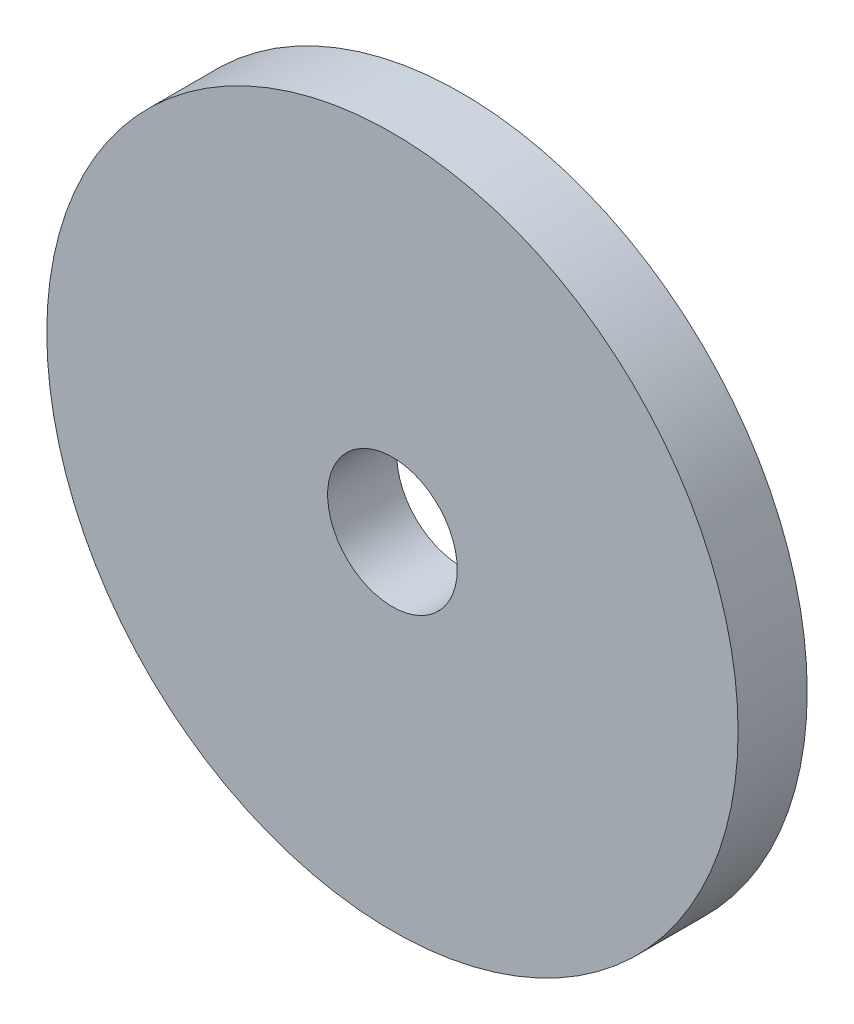
ISO-10303-21;
HEADER;
FILE_DESCRIPTION(('STEP AP214'),'2;1');
FILE_NAME('part.step','',(''),(''),'','','');
FILE_SCHEMA(('AUTOMOTIVE_DESIGN { 1 0 10303 214 1 1 1 1 }'));
ENDSEC;
DATA;
#1=APPLICATION_CONTEXT('core data for automotive mechanical design processes');
#2=APPLICATION_PROTOCOL_DEFINITION('international standard','automotive_design',2000,#1);
#3=PRODUCT_CONTEXT('',#1,'mechanical');
#4=PRODUCT('Part','Part','',(#3));
#5=PRODUCT_RELATED_PRODUCT_CATEGORY('part','',(#4));
#6=PRODUCT_DEFINITION_FORMATION('','',#4);
#7=PRODUCT_DEFINITION_CONTEXT('part definition',#1,'design');
#8=PRODUCT_DEFINITION('design','',#6,#7);
#9=PRODUCT_DEFINITION_SHAPE('','',#8);
#10=(LENGTH_UNIT() NAMED_UNIT(*) SI_UNIT(.MILLI.,.METRE.));
#11=(NAMED_UNIT(*) PLANE_ANGLE_UNIT() SI_UNIT($,.RADIAN.));
#12=(NAMED_UNIT(*) SI_UNIT($,.STERADIAN.) SOLID_ANGLE_UNIT());
#13=UNCERTAINTY_MEASURE_WITH_UNIT(LENGTH_MEASURE(1.E-05),#10,'distance_accuracy_value','');
#14=(GEOMETRIC_REPRESENTATION_CONTEXT(3) GLOBAL_UNCERTAINTY_ASSIGNED_CONTEXT((#13)) GLOBAL_UNIT_ASSIGNED_CONTEXT((#10,
#11,#12)) REPRESENTATION_CONTEXT('',''));
#15=CARTESIAN_POINT('',(0.,0.,0.));
#16=DIRECTION('',(0.,0.,1.));
#17=DIRECTION('',(1.,0.,0.));
#18=AXIS2_PLACEMENT_3D('',#15,#16,#17);
#19=CARTESIAN_POINT('',(0.,0.,2.54));
#20=DIRECTION('',(0.,0.,1.));
#21=DIRECTION('',(1.,0.,0.));
#22=AXIS2_PLACEMENT_3D('',#19,#20,#21);
#23=PLANE('',#22);
#24=CARTESIAN_POINT('',(0.,0.,2.54));
#25=DIRECTION('',(0.,0.,1.));
#26=DIRECTION('',(1.,0.,0.));
#27=AXIS2_PLACEMENT_3D('',#24,#25,#26);
#28=CIRCLE('',#27,12.7);
#29=CARTESIAN_POINT('',(12.7,0.,2.54));
#30=VERTEX_POINT('',#29);
#31=EDGE_CURVE('E10',#30,#30,#28,.T.);
#32=ORIENTED_EDGE('',*,*,#31,.T.);
#33=EDGE_LOOP('',(#32));
#34=FACE_BOUND('',#33,.T.);
#35=CARTESIAN_POINT('',(0.,0.,2.54));
#36=DIRECTION('',(0.,0.,1.));
#37=DIRECTION('',(1.,0.,0.));
#38=AXIS2_PLACEMENT_3D('',#35,#36,#37);
#39=CIRCLE('',#38,2.38125);
#40=CARTESIAN_POINT('',(2.38125,0.,2.54));
#41=VERTEX_POINT('',#40);
#42=EDGE_CURVE('E45',#41,#41,#39,.T.);
#43=ORIENTED_EDGE('',*,*,#42,.F.);
#44=EDGE_LOOP('',(#43));
#45=FACE_BOUND('',#44,.T.);
#46=ADVANCED_FACE('F34',(#34,#45),#23,.T.);
#47=CARTESIAN_POINT('',(0.,0.,0.));
#48=DIRECTION('',(0.,0.,1.));
#49=DIRECTION('',(1.,0.,0.));
#50=AXIS2_PLACEMENT_3D('',#47,#48,#49);
#51=PLANE('',#50);
#52=CARTESIAN_POINT('',(0.,0.,0.));
#53=DIRECTION('',(0.,0.,1.));
#54=DIRECTION('',(1.,0.,0.));
#55=AXIS2_PLACEMENT_3D('',#52,#53,#54);
#56=CIRCLE('',#55,12.7);
#57=CARTESIAN_POINT('',(12.7,0.,0.));
#58=VERTEX_POINT('',#57);
#59=EDGE_CURVE('E38',#58,#58,#56,.T.);
#60=ORIENTED_EDGE('',*,*,#59,.F.);
#61=EDGE_LOOP('',(#60));
#62=FACE_BOUND('',#61,.T.);
#63=CARTESIAN_POINT('',(0.,0.,0.));
#64=DIRECTION('',(0.,0.,1.));
#65=DIRECTION('',(1.,0.,0.));
#66=AXIS2_PLACEMENT_3D('',#63,#64,#65);
#67=CIRCLE('',#66,2.38125);
#68=CARTESIAN_POINT('',(2.38125,0.,0.));
#69=VERTEX_POINT('',#68);
#70=EDGE_CURVE('E47',#69,#69,#67,.T.);
#71=ORIENTED_EDGE('',*,*,#70,.T.);
#72=EDGE_LOOP('',(#71));
#73=FACE_BOUND('',#72,.T.);
#74=ADVANCED_FACE('F57',(#62,#73),#51,.F.);
#75=CARTESIAN_POINT('',(0.,0.,2.54));
#76=DIRECTION('',(0.,0.,-1.));
#77=DIRECTION('',(-1.,0.,0.));
#78=AXIS2_PLACEMENT_3D('',#75,#76,#77);
#79=CYLINDRICAL_SURFACE('',#78,12.7);
#80=ORIENTED_EDGE('',*,*,#31,.F.);
#81=EDGE_LOOP('',(#80));
#82=FACE_BOUND('',#81,.T.);
#83=ORIENTED_EDGE('',*,*,#59,.T.);
#84=EDGE_LOOP('',(#83));
#85=FACE_BOUND('',#84,.T.);
#86=ADVANCED_FACE('F36',(#82,#85),#79,.T.);
#87=CARTESIAN_POINT('',(0.,0.,2.54));
#88=DIRECTION('',(0.,0.,-1.));
#89=DIRECTION('',(-1.,0.,0.));
#90=AXIS2_PLACEMENT_3D('',#87,#88,#89);
#91=CYLINDRICAL_SURFACE('',#90,2.38125);
#92=ORIENTED_EDGE('',*,*,#42,.T.);
#93=EDGE_LOOP('',(#92));
#94=FACE_BOUND('',#93,.T.);
#95=ORIENTED_EDGE('',*,*,#70,.F.);
#96=EDGE_LOOP('',(#95));
#97=FACE_BOUND('',#96,.T.);
#98=ADVANCED_FACE('F53',(#94,#97),#91,.F.);
#99=CLOSED_SHELL('',(#46,#74,#86,#98));
#100=MANIFOLD_SOLID_BREP('B2',#99);
#101=ADVANCED_BREP_SHAPE_REPRESENTATION('',(#18,#100),#14);
#102=SHAPE_DEFINITION_REPRESENTATION(#9,#101);
ENDSEC;
END-ISO-10303-21;
